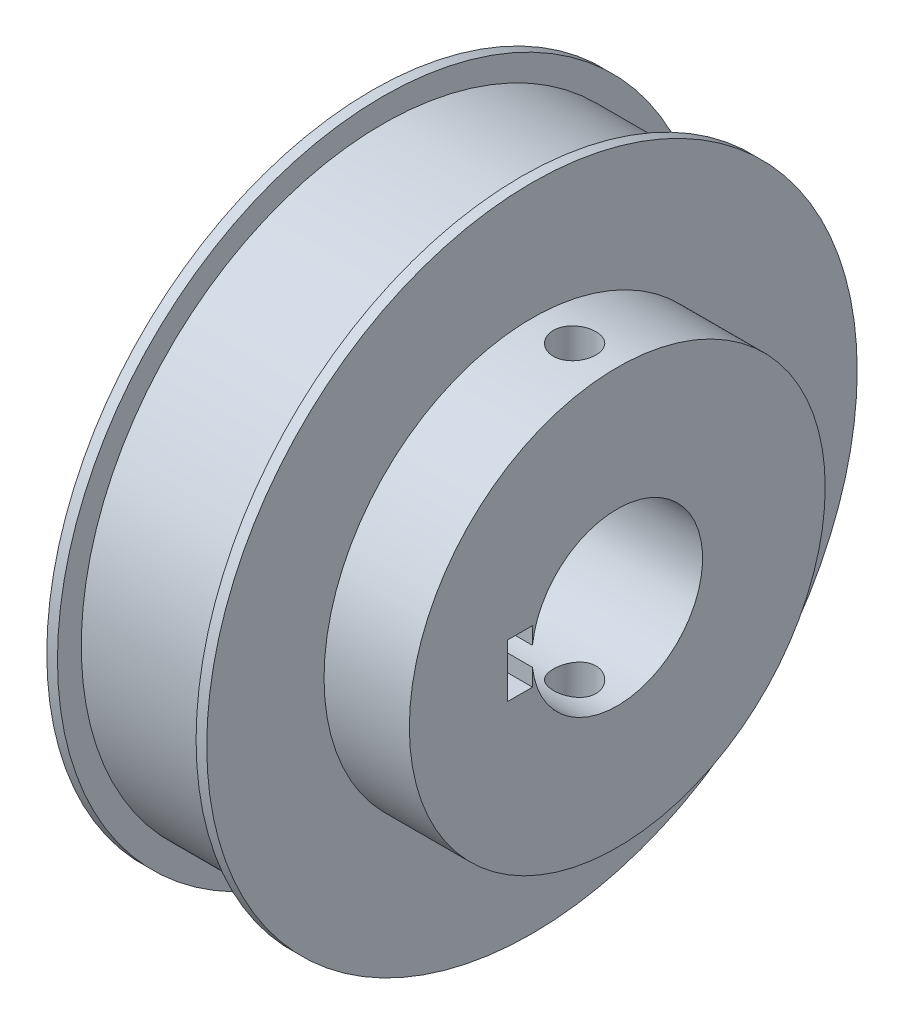
ISO-10303-21;
HEADER;
FILE_DESCRIPTION(('STEP AP214'),'2;1');
FILE_NAME('part.step','',(''),(''),'','','');
FILE_SCHEMA(('AUTOMOTIVE_DESIGN { 1 0 10303 214 1 1 1 1 }'));
ENDSEC;
DATA;
#1=APPLICATION_CONTEXT('core data for automotive mechanical design processes');
#2=APPLICATION_PROTOCOL_DEFINITION('international standard','automotive_design',2000,#1);
#3=PRODUCT_CONTEXT('',#1,'mechanical');
#4=PRODUCT('Part','Part','',(#3));
#5=PRODUCT_RELATED_PRODUCT_CATEGORY('part','',(#4));
#6=PRODUCT_DEFINITION_FORMATION('','',#4);
#7=PRODUCT_DEFINITION_CONTEXT('part definition',#1,'design');
#8=PRODUCT_DEFINITION('design','',#6,#7);
#9=PRODUCT_DEFINITION_SHAPE('','',#8);
#10=(LENGTH_UNIT() NAMED_UNIT(*) SI_UNIT(.MILLI.,.METRE.));
#11=(NAMED_UNIT(*) PLANE_ANGLE_UNIT() SI_UNIT($,.RADIAN.));
#12=(NAMED_UNIT(*) SI_UNIT($,.STERADIAN.) SOLID_ANGLE_UNIT());
#13=UNCERTAINTY_MEASURE_WITH_UNIT(LENGTH_MEASURE(1.E-05),#10,'distance_accuracy_value','');
#14=(GEOMETRIC_REPRESENTATION_CONTEXT(3) GLOBAL_UNCERTAINTY_ASSIGNED_CONTEXT((#13)) GLOBAL_UNIT_ASSIGNED_CONTEXT((#10,
#11,#12)) REPRESENTATION_CONTEXT('',''));
#15=CARTESIAN_POINT('',(0.,0.,0.));
#16=DIRECTION('',(0.,0.,1.));
#17=DIRECTION('',(1.,0.,0.));
#18=AXIS2_PLACEMENT_3D('',#15,#16,#17);
#19=CARTESIAN_POINT('',(0.0213,28.0213,38.4713));
#20=DIRECTION('',(0.,0.,1.));
#21=DIRECTION('',(1.,0.,0.));
#22=AXIS2_PLACEMENT_3D('',#19,#20,#21);
#23=PLANE('',#22);
#24=DIRECTION('',(0.,1.,0.));
#25=VECTOR('',#24,1.);
#26=CARTESIAN_POINT('',(23.0213,30.5213,38.4713));
#27=LINE('',#26,#25);
#28=CARTESIAN_POINT('',(23.0213,29.6282714450257,38.4713));
#29=VERTEX_POINT('',#28);
#30=CARTESIAN_POINT('',(23.0213,28.0213,38.4713));
#31=VERTEX_POINT('',#30);
#32=EDGE_CURVE('E79',#29,#31,#27,.F.);
#33=ORIENTED_EDGE('',*,*,#32,.F.);
#34=DIRECTION('',(1.,0.,0.));
#35=VECTOR('',#34,1.);
#36=CARTESIAN_POINT('',(0.0213,29.628271445025,38.4713));
#37=LINE('',#36,#35);
#38=CARTESIAN_POINT('',(0.0213,29.6282714450252,38.4713));
#39=VERTEX_POINT('',#38);
#40=EDGE_CURVE('E58',#29,#39,#37,.F.);
#41=ORIENTED_EDGE('',*,*,#40,.T.);
#42=DIRECTION('',(0.,1.,0.));
#43=VECTOR('',#42,1.);
#44=CARTESIAN_POINT('',(0.0213,28.0213,38.4713));
#45=LINE('',#44,#43);
#46=CARTESIAN_POINT('',(0.0213,28.0213,38.4713));
#47=VERTEX_POINT('',#46);
#48=EDGE_CURVE('E97',#39,#47,#45,.F.);
#49=ORIENTED_EDGE('',*,*,#48,.T.);
#50=DIRECTION('',(1.,0.,0.));
#51=VECTOR('',#50,1.);
#52=CARTESIAN_POINT('',(0.0213,28.0213,38.4713));
#53=LINE('',#52,#51);
#54=EDGE_CURVE('E114',#31,#47,#53,.F.);
#55=ORIENTED_EDGE('',*,*,#54,.F.);
#56=EDGE_LOOP('',(#33,#41,#49,#55));
#57=FACE_BOUND('',#56,.T.);
#58=ADVANCED_FACE('F16',(#57),#23,.T.);
#59=CARTESIAN_POINT('',(0.0213,28.0213,38.4713));
#60=DIRECTION('',(0.,0.,1.));
#61=DIRECTION('',(1.,0.,0.));
#62=AXIS2_PLACEMENT_3D('',#59,#60,#61);
#63=PLANE('',#62);
#64=DIRECTION('',(0.,1.,0.));
#65=VECTOR('',#64,1.);
#66=CARTESIAN_POINT('',(23.0213,30.5213,38.4713));
#67=LINE('',#66,#65);
#68=CARTESIAN_POINT('',(23.0213,33.0213,38.4713));
#69=VERTEX_POINT('',#68);
#70=CARTESIAN_POINT('',(23.0213,31.4143285549748,38.4713));
#71=VERTEX_POINT('',#70);
#72=EDGE_CURVE('E70',#69,#71,#67,.F.);
#73=ORIENTED_EDGE('',*,*,#72,.F.);
#74=DIRECTION('',(1.,0.,0.));
#75=VECTOR('',#74,1.);
#76=CARTESIAN_POINT('',(0.0213,33.0213,38.4713));
#77=LINE('',#76,#75);
#78=CARTESIAN_POINT('',(0.0213,33.0213,38.4713));
#79=VERTEX_POINT('',#78);
#80=EDGE_CURVE('E109',#69,#79,#77,.F.);
#81=ORIENTED_EDGE('',*,*,#80,.T.);
#82=DIRECTION('',(0.,1.,0.));
#83=VECTOR('',#82,1.);
#84=CARTESIAN_POINT('',(0.0213,28.0213,38.4713));
#85=LINE('',#84,#83);
#86=CARTESIAN_POINT('',(0.0213,31.4143285549738,38.4713000000001));
#87=VERTEX_POINT('',#86);
#88=EDGE_CURVE('E35',#79,#87,#85,.F.);
#89=ORIENTED_EDGE('',*,*,#88,.T.);
#90=DIRECTION('',(1.,0.,0.));
#91=VECTOR('',#90,1.);
#92=CARTESIAN_POINT('',(0.0213,31.414328554973,38.4713000000002));
#93=LINE('',#92,#91);
#94=EDGE_CURVE('E66',#87,#71,#93,.T.);
#95=ORIENTED_EDGE('',*,*,#94,.T.);
#96=EDGE_LOOP('',(#73,#81,#89,#95));
#97=FACE_BOUND('',#96,.T.);
#98=ADVANCED_FACE('F67',(#97),#63,.T.);
#99=CARTESIAN_POINT('',(23.0213,30.5213,30.5213));
#100=DIRECTION('',(1.,0.,0.));
#101=DIRECTION('',(0.,0.,-1.));
#102=AXIS2_PLACEMENT_3D('',#99,#100,#101);
#103=PLANE('',#102);
#104=DIRECTION('',(0.,0.,1.));
#105=VECTOR('',#104,1.);
#106=CARTESIAN_POINT('',(23.0213,33.0213,38.4713));
#107=LINE('',#106,#105);
#108=CARTESIAN_POINT('',(23.0213,33.0213,40.8213));
#109=VERTEX_POINT('',#108);
#110=EDGE_CURVE('E84',#109,#69,#107,.F.);
#111=ORIENTED_EDGE('',*,*,#110,.T.);
#112=ORIENTED_EDGE('',*,*,#72,.T.);
#113=CARTESIAN_POINT('',(23.0213,30.5213,30.5213));
#114=DIRECTION('',(1.,0.,0.));
#115=DIRECTION('',(0.,0.,-1.));
#116=AXIS2_PLACEMENT_3D('',#113,#114,#115);
#117=CIRCLE('',#116,8.);
#118=EDGE_CURVE('E20',#71,#29,#117,.F.);
#119=ORIENTED_EDGE('',*,*,#118,.T.);
#120=ORIENTED_EDGE('',*,*,#32,.T.);
#121=DIRECTION('',(0.,0.,1.));
#122=VECTOR('',#121,1.);
#123=CARTESIAN_POINT('',(23.0213,28.0213,38.4713));
#124=LINE('',#123,#122);
#125=CARTESIAN_POINT('',(23.0213,28.0213,40.8213));
#126=VERTEX_POINT('',#125);
#127=EDGE_CURVE('E117',#126,#31,#124,.F.);
#128=ORIENTED_EDGE('',*,*,#127,.F.);
#129=DIRECTION('',(0.,1.,0.));
#130=VECTOR('',#129,1.);
#131=CARTESIAN_POINT('',(23.0213,28.0213,40.8213));
#132=LINE('',#131,#130);
#133=EDGE_CURVE('E111',#126,#109,#132,.T.);
#134=ORIENTED_EDGE('',*,*,#133,.T.);
#135=EDGE_LOOP('',(#111,#112,#119,#120,#128,#134));
#136=FACE_BOUND('',#135,.T.);
#137=CARTESIAN_POINT('',(23.0213,30.5213,30.5213));
#138=DIRECTION('',(1.,0.,0.));
#139=DIRECTION('',(0.,0.,-1.));
#140=AXIS2_PLACEMENT_3D('',#137,#138,#139);
#141=CIRCLE('',#140,19.5);
#142=CARTESIAN_POINT('',(23.0213,30.5213,11.0213));
#143=VERTEX_POINT('',#142);
#144=EDGE_CURVE('E105',#143,#143,#141,.F.);
#145=ORIENTED_EDGE('',*,*,#144,.F.);
#146=EDGE_LOOP('',(#145));
#147=FACE_BOUND('',#146,.T.);
#148=ADVANCED_FACE('F80',(#136,#147),#103,.T.);
#149=CARTESIAN_POINT('',(19.0213,50.0213,30.5213));
#150=DIRECTION('',(0.,-1.,0.));
#151=DIRECTION('',(0.,0.,-1.));
#152=AXIS2_PLACEMENT_3D('',#149,#150,#151);
#153=CYLINDRICAL_SURFACE('',#152,2.);
#154=CARTESIAN_POINT('',(21.0213000416667,50.0213000416667,30.5213));
#155=CARTESIAN_POINT('',(21.0212952449661,50.0212988039961,30.6332257199853));
#156=CARTESIAN_POINT('',(21.0118656679429,50.0203254222127,30.745299632185));
#157=CARTESIAN_POINT('',(20.9743730017809,50.016534232403,30.966414845535));
#158=CARTESIAN_POINT('',(20.9462707943776,50.0137125524571,31.0754492784028));
#159=CARTESIAN_POINT('',(20.8722568807324,50.0065429669759,31.2871394420739));
#160=CARTESIAN_POINT('',(20.826362863846,50.0021965777769,31.3898013914173));
#161=CARTESIAN_POINT('',(20.7181022188427,49.9924644594225,31.5859155066101));
#162=CARTESIAN_POINT('',(20.6557427472886,49.9870791820839,31.6793716495086));
#163=CARTESIAN_POINT('',(20.5160566395998,49.9758482682691,31.8548365334591));
#164=CARTESIAN_POINT('',(20.4386790643447,49.9700011063528,31.936804631482));
#165=CARTESIAN_POINT('',(20.2712586054062,49.9585178137885,32.0866190392071));
#166=CARTESIAN_POINT('',(20.1812145125114,49.9528817033536,32.1544639991062));
#167=CARTESIAN_POINT('',(19.9907735152286,49.9424439847177,32.2742409440422));
#168=CARTESIAN_POINT('',(19.8903541188884,49.9376442527855,32.32613734531));
#169=CARTESIAN_POINT('',(19.6821697225814,49.9294411523572,32.4123161473707));
#170=CARTESIAN_POINT('',(19.5744049772475,49.9260377354853,32.4465991583957));
#171=CARTESIAN_POINT('',(19.354991723457,49.9210260308223,32.496461297801));
#172=CARTESIAN_POINT('',(19.2433582771978,49.9194114449488,32.5121060621168));
#173=CARTESIAN_POINT('',(19.0190391362712,49.9181406871204,32.5244505096382));
#174=CARTESIAN_POINT('',(18.9063534688261,49.9184844646399,32.521150681613));
#175=CARTESIAN_POINT('',(18.6835827805728,49.9210858336635,32.4957537491147));
#176=CARTESIAN_POINT('',(18.5734894657198,49.923336105053,32.4737285409038));
#177=CARTESIAN_POINT('',(18.3585692264664,49.9294855125986,32.4116176130418));
#178=CARTESIAN_POINT('',(18.2537424243687,49.933384687027,32.371531474182));
#179=CARTESIAN_POINT('',(18.0521017984836,49.9424011280114,32.274355832986));
#180=CARTESIAN_POINT('',(17.9553037043851,49.9475207129737,32.217233915389));
#181=CARTESIAN_POINT('',(17.7726491390129,49.9583986445013,32.0876365425042));
#182=CARTESIAN_POINT('',(17.6867921027281,49.964156958053,32.0151618805681));
#183=CARTESIAN_POINT('',(17.52804533039,49.9756953984157,31.8565296908881));
#184=CARTESIAN_POINT('',(17.4552149814833,49.9814755083042,31.7703127262092));
#185=CARTESIAN_POINT('',(17.3250175786765,49.9923849554681,31.5867977375404));
#186=CARTESIAN_POINT('',(17.2676576817804,49.997513990962,31.4894946143335));
#187=CARTESIAN_POINT('',(17.1700382015131,50.0065456027029,31.2865027261696));
#188=CARTESIAN_POINT('',(17.1297959076608,50.0104469378898,31.1808056101484));
#189=CARTESIAN_POINT('',(17.0677304060595,50.016567790704,30.9642500556859));
#190=CARTESIAN_POINT('',(17.0458681377659,50.0187908738579,30.8534030936173));
#191=CARTESIAN_POINT('',(17.0294183389221,50.0204688451888,30.7050626356356));
#192=CARTESIAN_POINT('',(17.0263762041943,50.0207799090044,30.6683811550961));
#193=CARTESIAN_POINT('',(17.0223162398791,50.0211956958089,30.5949051261092));
#194=CARTESIAN_POINT('',(17.0212984107397,50.0213004187521,30.5581105776369));
#195=CARTESIAN_POINT('',(17.0213048322826,50.0212987267483,30.409374276951));
#196=CARTESIAN_POINT('',(17.0307343533963,50.0203254014306,30.2973003616699));
#197=CARTESIAN_POINT('',(17.068226978917,50.0165342530182,30.0761851483488));
#198=CARTESIAN_POINT('',(17.0963292010763,50.0137125579189,29.9671507184797));
#199=CARTESIAN_POINT('',(17.1703431245879,50.0065429614441,29.7554605588135));
#200=CARTESIAN_POINT('',(17.2162371367967,50.0021965763692,29.6527986105448));
#201=CARTESIAN_POINT('',(17.3244977785924,49.9924644610024,29.4566844949112));
#202=CARTESIAN_POINT('',(17.3868572520325,49.987079182503,29.3632283507295));
#203=CARTESIAN_POINT('',(17.5265433619495,49.9758482677788,29.1877634652116));
#204=CARTESIAN_POINT('',(17.6039209374232,49.970001106122,29.1057953668097));
#205=CARTESIAN_POINT('',(17.7713413963718,49.958517813776,28.9559809593282));
#206=CARTESIAN_POINT('',(17.8613854889202,49.9528817032976,28.8881359998978));
#207=CARTESIAN_POINT('',(18.0518264856428,49.9424439846474,28.7683590555056));
#208=CARTESIAN_POINT('',(18.1522458818063,49.9376442527479,28.7164626543717));
#209=CARTESIAN_POINT('',(18.3604302781222,49.9294411523397,28.6302838523687));
#210=CARTESIAN_POINT('',(18.4681950236676,49.9260377354601,28.5960008413292));
#211=CARTESIAN_POINT('',(18.6876082777112,49.9210260307999,28.5461387020004));
#212=CARTESIAN_POINT('',(18.7992417240057,49.9194114449342,28.5304939377475));
#213=CARTESIAN_POINT('',(19.0235608649367,49.9181406871214,28.5181494903649));
#214=CARTESIAN_POINT('',(19.1362465323506,49.9184844646475,28.5214493184563));
#215=CARTESIAN_POINT('',(19.3590172206539,49.921085833684,28.5468462510899));
#216=CARTESIAN_POINT('',(19.4691105355856,49.9233361050818,28.5688714593904));
#217=CARTESIAN_POINT('',(19.6840307747959,49.9294855126433,28.6309823874059));
#218=CARTESIAN_POINT('',(19.7888575767806,49.9333846870765,28.671068526299));
#219=CARTESIAN_POINT('',(19.9904982022038,49.9424011280441,28.7682441674182));
#220=CARTESIAN_POINT('',(20.087296295972,49.9475207129818,28.8253660848671));
#221=CARTESIAN_POINT('',(20.2699508613653,49.958398644537,28.9549634577613));
#222=CARTESIAN_POINT('',(20.3558078979338,49.9641569581448,29.0274381199503));
#223=CARTESIAN_POINT('',(20.5145546709821,49.9756953984716,29.1860703106267));
#224=CARTESIAN_POINT('',(20.5873850202454,49.9814755082673,29.2722872761183));
#225=CARTESIAN_POINT('',(20.7175824230739,49.9923849557966,29.455802265036));
#226=CARTESIAN_POINT('',(20.77494231989,49.9975139917598,29.5531053874976));
#227=CARTESIAN_POINT('',(20.8725617975646,50.0065456019737,29.7560972735566));
#228=CARTESIAN_POINT('',(20.9128040889906,50.0104469351682,29.8617943881755));
#229=CARTESIAN_POINT('',(20.9748695962545,50.0165677933185,30.0783499424026));
#230=CARTESIAN_POINT('',(20.9967318721283,50.0187908837364,30.1891969057823));
#231=CARTESIAN_POINT('',(21.0131816579855,50.02046884197,30.3375373658827));
#232=CARTESIAN_POINT('',(21.0162237876461,50.0207799007193,30.3742188468414));
#233=CARTESIAN_POINT('',(21.0202837684745,50.0211957041139,30.4476948754636));
#234=CARTESIAN_POINT('',(21.0213016192247,50.0213004487167,30.4844894231504));
#235=CARTESIAN_POINT('',(21.0213000416667,50.0213000416667,30.5213));
#236=B_SPLINE_CURVE_WITH_KNOTS('',3,(#154,#155,#156,#157,#158,#159,#160,#161,#162,#163,#164,
#165,#166,#167,#168,#169,#170,#171,#172,#173,#174,#175,#176,#177,#178,#179,#180,#181,#182,#183,
#184,#185,#186,#187,#188,#189,#190,#191,#192,#193,#194,#195,#196,#197,#198,#199,#200,#201,#202,
#203,#204,#205,#206,#207,#208,#209,#210,#211,#212,#213,#214,#215,#216,#217,#218,#219,#220,#221,
#222,#223,#224,#225,#226,#227,#228,#229,#230,#231,#232,#233,#234,#235),.UNSPECIFIED.,.T.,.F.,(4,
2,2,2,2,2,2,2,2,2,2,2,2,2,2,2,2,2,2,2,2,2,2,2,2,2,2,2,2,2,2,2,2,2,2,2,2,2,2,2,4),(0.,
0.335636973965113,0.671979317597064,1.00798810981353,1.34385109852633,1.68087384584154,
2.01792878895439,2.3557303849996,2.69352027680916,3.03011706721512,3.36670517348347,
3.70200675294387,4.03731611542408,4.37326761174449,4.70920175203519,5.04663037054472,
5.38421482494498,5.72213944920167,6.05934410017865,6.16972970214156,6.28011532852622,
6.61575230682097,6.95209464284481,7.28810343108636,7.62396642434724,7.96098917350013,
8.29804411477922,8.63584571023136,8.97363560263294,9.31023239312093,9.64682049930136,
9.98212207904463,10.3174314412404,10.6533829365222,10.9893170778567,11.3267456991399,
11.6643301507704,12.0022547705161,12.3394594260006,12.4498450288431,12.5602306544646),.UNSPECIFIED.);
#237=CARTESIAN_POINT('',(21.0213000416667,50.0213000416667,30.5213));
#238=VERTEX_POINT('',#237);
#239=EDGE_CURVE('E163',#238,#238,#236,.T.);
#240=ORIENTED_EDGE('',*,*,#239,.F.);
#241=EDGE_LOOP('',(#240));
#242=FACE_BOUND('',#241,.T.);
#243=CARTESIAN_POINT('',(21.0213,38.5213,30.5213));
#244=CARTESIAN_POINT('',(21.0212943551092,38.5212967232233,30.4109265058065));
#245=CARTESIAN_POINT('',(21.0121228022313,38.5189904338893,30.3004232140391));
#246=CARTESIAN_POINT('',(20.975703069722,38.5100040073668,30.0824852357951));
#247=CARTESIAN_POINT('',(20.9484208560528,38.5033156355606,29.9750567247731));
#248=CARTESIAN_POINT('',(20.8767088873548,38.4863070093234,29.7665940848464));
#249=CARTESIAN_POINT('',(20.8323085240754,38.475992982781,29.6655493392886));
#250=CARTESIAN_POINT('',(20.7277072322132,38.4528341840969,29.472375781654));
#251=CARTESIAN_POINT('',(20.6675103883455,38.4399900664097,29.3802446730716));
#252=CARTESIAN_POINT('',(20.5317008259397,38.412865884715,29.2055668233512));
#253=CARTESIAN_POINT('',(20.4558220705619,38.3985635464031,29.1232303508182));
#254=CARTESIAN_POINT('',(20.2913685910166,38.370282371055,28.9723051174588));
#255=CARTESIAN_POINT('',(20.2027917412094,38.3563035886375,28.903718662982));
#256=CARTESIAN_POINT('',(20.0138393237289,38.3300302901337,28.7812643886937));
#257=CARTESIAN_POINT('',(19.9133082417737,38.3177638306106,28.7276299667376));
#258=CARTESIAN_POINT('',(19.7043012748183,38.2966265285306,28.6381038371054));
#259=CARTESIAN_POINT('',(19.595826725028,38.2877551168569,28.6022091553972));
#260=CARTESIAN_POINT('',(19.3763087356128,38.2746396932728,28.5498935681706));
#261=CARTESIAN_POINT('',(19.2653602740414,38.2703065518464,28.5330969957999));
#262=CARTESIAN_POINT('',(19.0421420445204,38.2664914988918,28.5182842977197));
#263=CARTESIAN_POINT('',(18.9298724928555,38.267008804003,28.5202651394058));
#264=CARTESIAN_POINT('',(18.7100792808956,38.2727560641484,28.5426512620788));
#265=CARTESIAN_POINT('',(18.6025065484016,38.2778714728833,28.5626087406262));
#266=CARTESIAN_POINT('',(18.3922859446402,38.2920560689353,28.6196675127474));
#267=CARTESIAN_POINT('',(18.2896384573448,38.3011255639587,28.6567701405674));
#268=CARTESIAN_POINT('',(18.090979299873,38.3223018759886,28.7474488629789));
#269=CARTESIAN_POINT('',(17.9950453394808,38.3344385158416,28.801187946315));
#270=CARTESIAN_POINT('',(17.8134026143021,38.3603637372651,28.9234963472254));
#271=CARTESIAN_POINT('',(17.7276949562499,38.374152497312,28.99206726771));
#272=CARTESIAN_POINT('',(17.5663782019942,38.4023088932488,29.1443996069856));
#273=CARTESIAN_POINT('',(17.491124192049,38.4166818591952,29.228536494027));
#274=CARTESIAN_POINT('',(17.355695671491,38.444040996237,29.4084473024731));
#275=CARTESIAN_POINT('',(17.2955276476748,38.4570265693972,29.5042262036146));
#276=CARTESIAN_POINT('',(17.1918501103733,38.4802141964943,29.7052357541348));
#277=CARTESIAN_POINT('',(17.1484114496638,38.4904043599643,29.810504323475));
#278=CARTESIAN_POINT('',(17.0800276118664,38.5067505931434,30.0270328167494));
#279=CARTESIAN_POINT('',(17.0550439144675,38.5129150623863,30.1382797383203));
#280=CARTESIAN_POINT('',(17.0335606388046,38.5182422052241,30.2955853685857));
#281=CARTESIAN_POINT('',(17.0289673432076,38.5193860551192,30.3405913577974));
#282=CARTESIAN_POINT('',(17.0228358630925,38.5209156250803,30.430824292738));
#283=CARTESIAN_POINT('',(17.0212976858183,38.5213013433487,30.4760512389906));
#284=CARTESIAN_POINT('',(17.0213056448908,38.5212967232233,30.6316734941935));
#285=CARTESIAN_POINT('',(17.0304771977687,38.5189904338893,30.7421767859609));
#286=CARTESIAN_POINT('',(17.066896930278,38.5100040073668,30.9601147642049));
#287=CARTESIAN_POINT('',(17.0941791439473,38.5033156355606,31.0675432752269));
#288=CARTESIAN_POINT('',(17.1658911126452,38.4863070093234,31.2760059151536));
#289=CARTESIAN_POINT('',(17.2102914759246,38.475992982781,31.3770506607114));
#290=CARTESIAN_POINT('',(17.3148927677868,38.4528341840969,31.570224218346));
#291=CARTESIAN_POINT('',(17.3750896116545,38.4399900664097,31.6623553269284));
#292=CARTESIAN_POINT('',(17.5108991740603,38.412865884715,31.8370331766488));
#293=CARTESIAN_POINT('',(17.5867779294381,38.3985635464031,31.9193696491818));
#294=CARTESIAN_POINT('',(17.7512314089834,38.370282371055,32.0702948825412));
#295=CARTESIAN_POINT('',(17.8398082587906,38.3563035886375,32.138881337018));
#296=CARTESIAN_POINT('',(18.0287606762711,38.3300302901337,32.2613356113063));
#297=CARTESIAN_POINT('',(18.1292917582263,38.3177638306106,32.3149700332624));
#298=CARTESIAN_POINT('',(18.3382987251817,38.2966265285306,32.4044961628946));
#299=CARTESIAN_POINT('',(18.446773274972,38.2877551168569,32.4403908446028));
#300=CARTESIAN_POINT('',(18.6662912643872,38.2746396932728,32.4927064318294));
#301=CARTESIAN_POINT('',(18.7772397259586,38.2703065518464,32.5095030042001));
#302=CARTESIAN_POINT('',(19.0004579554796,38.2664914988918,32.5243157022803));
#303=CARTESIAN_POINT('',(19.1127275071445,38.267008804003,32.5223348605942));
#304=CARTESIAN_POINT('',(19.3325207191044,38.2727560641484,32.4999487379212));
#305=CARTESIAN_POINT('',(19.4400934515984,38.2778714728833,32.4799912593738));
#306=CARTESIAN_POINT('',(19.6503140553598,38.2920560689353,32.4229324872526));
#307=CARTESIAN_POINT('',(19.7529615426552,38.3011255639587,32.3858298594326));
#308=CARTESIAN_POINT('',(19.951620700127,38.3223018759886,32.2951511370211));
#309=CARTESIAN_POINT('',(20.0475546605192,38.3344385158416,32.241412053685));
#310=CARTESIAN_POINT('',(20.2291973856979,38.3603637372651,32.1191036527746));
#311=CARTESIAN_POINT('',(20.31490504375,38.374152497312,32.05053273229));
#312=CARTESIAN_POINT('',(20.4762217980058,38.4023088932488,31.8982003930144));
#313=CARTESIAN_POINT('',(20.551475807951,38.4166818591952,31.814063505973));
#314=CARTESIAN_POINT('',(20.686904328509,38.444040996237,31.6341526975269));
#315=CARTESIAN_POINT('',(20.7470723523252,38.4570265693972,31.5383737963854));
#316=CARTESIAN_POINT('',(20.8507498896267,38.4802141964943,31.3373642458652));
#317=CARTESIAN_POINT('',(20.8941885503362,38.4904043599643,31.232095676525));
#318=CARTESIAN_POINT('',(20.9625723881336,38.5067505931434,31.0155671832507));
#319=CARTESIAN_POINT('',(20.9875560855325,38.5129150623863,30.9043202616798));
#320=CARTESIAN_POINT('',(21.0090393611955,38.5182422052241,30.7470146314143));
#321=CARTESIAN_POINT('',(21.0136326567925,38.5193860551192,30.7020086422026));
#322=CARTESIAN_POINT('',(21.0197641369075,38.5209156250803,30.611775707262));
#323=CARTESIAN_POINT('',(21.0213023141816,38.5213013433487,30.5665487610094));
#324=CARTESIAN_POINT('',(21.0213,38.5213,30.5213));
#325=B_SPLINE_CURVE_WITH_KNOTS('',3,(#243,#244,#245,#246,#247,#248,#249,#250,#251,#252,#253,
#254,#255,#256,#257,#258,#259,#260,#261,#262,#263,#264,#265,#266,#267,#268,#269,#270,#271,#272,
#273,#274,#275,#276,#277,#278,#279,#280,#281,#282,#283,#284,#285,#286,#287,#288,#289,#290,#291,
#292,#293,#294,#295,#296,#297,#298,#299,#300,#301,#302,#303,#304,#305,#306,#307,#308,#309,#310,
#311,#312,#313,#314,#315,#316,#317,#318,#319,#320,#321,#322,#323,#324),.UNSPECIFIED.,.T.,.F.,(4,
2,2,2,2,2,2,2,2,2,2,2,2,2,2,2,2,2,2,2,2,2,2,2,2,2,2,2,2,2,2,2,2,2,2,2,2,2,2,2,4),(0.,
0.330946983045446,0.662517657801357,0.993521545220031,1.32443992457114,1.66151658222464,
1.99864973197669,2.34078329803452,2.68285948660786,3.01808373561039,3.35325384589237,
3.68029888738367,4.00736938400806,4.33775143805342,4.66816921509436,5.00795227856435,
5.34788119516374,5.68923436048328,6.02987300392473,6.16554783732439,6.30122299241518,
6.63216997546062,6.96374065021654,7.29474453763522,7.62566291698632,7.96273957463982,
8.29987272439186,8.6420062904497,8.98408247902304,9.31930672802556,9.65447683830756,
9.98152187979886,10.3085923764233,10.6389744304686,10.9693922075095,11.3091752709795,
11.6491041875789,11.9904573528985,12.3310959963399,12.4667708297396,12.6024459848304),.UNSPECIFIED.);
#326=CARTESIAN_POINT('',(21.0213,38.5213,30.5213));
#327=VERTEX_POINT('',#326);
#328=EDGE_CURVE('E86',#327,#327,#325,.T.);
#329=ORIENTED_EDGE('',*,*,#328,.F.);
#330=EDGE_LOOP('',(#329));
#331=FACE_BOUND('',#330,.T.);
#332=ADVANCED_FACE('F197',(#242,#331),#153,.F.);
#333=CARTESIAN_POINT('',(19.0213,11.0213,30.5213));
#334=DIRECTION('',(0.,1.,0.));
#335=DIRECTION('',(0.,0.,1.));
#336=AXIS2_PLACEMENT_3D('',#333,#334,#335);
#337=CYLINDRICAL_SURFACE('',#336,2.);
#338=CARTESIAN_POINT('',(21.0213,11.0213,30.5213));
#339=CARTESIAN_POINT('',(21.0212951677174,11.0213012732517,30.4093742769514));
#340=CARTESIAN_POINT('',(21.0118656466037,11.0222745985694,30.2973003616704));
#341=CARTESIAN_POINT('',(20.9743730210831,11.0260657469818,30.0761851483492));
#342=CARTESIAN_POINT('',(20.9462707989238,11.0288874420811,29.9671507184799));
#343=CARTESIAN_POINT('',(20.8722568754122,11.0360570385559,29.7554605588137));
#344=CARTESIAN_POINT('',(20.8263628632035,11.0404034236308,29.6527986105452));
#345=CARTESIAN_POINT('',(20.7181022214078,11.0501355389976,29.4566844949115));
#346=CARTESIAN_POINT('',(20.6557427479676,11.055520817497,29.3632283507297));
#347=CARTESIAN_POINT('',(20.5160566380495,11.0667517322213,29.1877634652104));
#348=CARTESIAN_POINT('',(20.4386790625747,11.0725988938781,29.1057953668074));
#349=CARTESIAN_POINT('',(20.2712586036257,11.0840821862241,28.9559809593263));
#350=CARTESIAN_POINT('',(20.1812145110785,11.0897182967025,28.888135999897));
#351=CARTESIAN_POINT('',(19.9907735143635,11.1001560153522,28.7683590555095));
#352=CARTESIAN_POINT('',(19.8903541182069,11.1049557472514,28.7164626543785));
#353=CARTESIAN_POINT('',(19.682169721892,11.1131588476599,28.6302838523732));
#354=CARTESIAN_POINT('',(19.5744049763397,11.1165622645398,28.5960008413309));
#355=CARTESIAN_POINT('',(19.3549917222594,11.1215739692007,28.5461387019937));
#356=CARTESIAN_POINT('',(19.2433582759342,11.1231885550666,28.5304939377391));
#357=CARTESIAN_POINT('',(19.0190391350026,11.1244593128785,28.5181494903666));
#358=CARTESIAN_POINT('',(18.9063534676195,11.1241155353524,28.5214493184597));
#359=CARTESIAN_POINT('',(18.6835827794549,11.1215141663171,28.5468462510774));
#360=CARTESIAN_POINT('',(18.5734894646295,11.1192638949217,28.5688714593471));
#361=CARTESIAN_POINT('',(18.3585692254111,11.1131144873653,28.6309823873273));
#362=CARTESIAN_POINT('',(18.2537424233222,11.1092153129315,28.6710685262512));
#363=CARTESIAN_POINT('',(18.0521017974761,11.1001988719382,28.7682441675707));
#364=CARTESIAN_POINT('',(17.9553037034069,11.0950792869725,28.8253660852256));
#365=CARTESIAN_POINT('',(17.7726491381085,11.0842013554405,28.9549634582169));
#366=CARTESIAN_POINT('',(17.6867921018675,11.0784430418877,29.0274381202009));
#367=CARTESIAN_POINT('',(17.5280453296224,11.0669046015252,29.1860703099704));
#368=CARTESIAN_POINT('',(17.4552149807653,11.0611244916379,29.272287274691));
#369=CARTESIAN_POINT('',(17.3250175780631,11.0502150444783,29.455802263436));
#370=CARTESIAN_POINT('',(17.2676576812222,11.0450860089876,29.5531053866772));
#371=CARTESIAN_POINT('',(17.1700382010715,11.036054397255,29.7560972748987));
#372=CARTESIAN_POINT('',(17.1297959072802,11.0321530620732,29.8617943909431));
#373=CARTESIAN_POINT('',(17.0677304058041,11.0260322092703,30.0783499454407));
#374=CARTESIAN_POINT('',(17.0458681375745,11.0238091261227,30.1891969075212));
#375=CARTESIAN_POINT('',(17.0294183388375,11.0221311548025,30.3375373653205));
#376=CARTESIAN_POINT('',(17.0263762041413,11.0218200909902,30.3742188456699));
#377=CARTESIAN_POINT('',(17.0223162398685,11.02140430419,30.4476948742747));
#378=CARTESIAN_POINT('',(17.0212984107397,11.0212995812479,30.4844894225551));
#379=CARTESIAN_POINT('',(17.0213048322826,11.0213012732517,30.6332257230486));
#380=CARTESIAN_POINT('',(17.0307343533963,11.0222745985694,30.7452996383296));
#381=CARTESIAN_POINT('',(17.0682269789169,11.0260657469818,30.9664148516508));
#382=CARTESIAN_POINT('',(17.0963292010762,11.0288874420811,31.0754492815201));
#383=CARTESIAN_POINT('',(17.1703431245878,11.0360570385559,31.2871394411863));
#384=CARTESIAN_POINT('',(17.2162371367965,11.0404034236308,31.3898013894548));
#385=CARTESIAN_POINT('',(17.3244977785922,11.0501355389976,31.5859155050885));
#386=CARTESIAN_POINT('',(17.3868572520324,11.055520817497,31.6793716492703));
#387=CARTESIAN_POINT('',(17.5265433619505,11.0667517322213,31.8548365347897));
#388=CARTESIAN_POINT('',(17.6039209374253,11.0725988938781,31.9368046331926));
#389=CARTESIAN_POINT('',(17.7713413963743,11.0840821862241,32.0866190406737));
#390=CARTESIAN_POINT('',(17.8613854889215,11.0897182967025,32.154464000103));
#391=CARTESIAN_POINT('',(18.0518264856365,11.1001560153522,32.2742409444905));
#392=CARTESIAN_POINT('',(18.1522458817931,11.1049557472514,32.3261373456215));
#393=CARTESIAN_POINT('',(18.3604302781081,11.1131588476599,32.4123161476268));
#394=CARTESIAN_POINT('',(18.4681950236603,11.1165622645398,32.4465991586691));
#395=CARTESIAN_POINT('',(18.6876082777406,11.1215739692007,32.4964612980063));
#396=CARTESIAN_POINT('',(18.7992417240658,11.1231885550666,32.5121060622609));
#397=CARTESIAN_POINT('',(19.0235608649974,11.1244593128785,32.5244505096334));
#398=CARTESIAN_POINT('',(19.1362465323805,11.1241155353524,32.5211506815403));
#399=CARTESIAN_POINT('',(19.3590172205451,11.1215141663171,32.4957537489226));
#400=CARTESIAN_POINT('',(19.4691105353705,11.1192638949217,32.4737285406529));
#401=CARTESIAN_POINT('',(19.6840307745889,11.1131144873653,32.4116176126727));
#402=CARTESIAN_POINT('',(19.7888575766778,11.1092153129315,32.3715314737488));
#403=CARTESIAN_POINT('',(19.9904982025239,11.1001988719382,32.2743558324293));
#404=CARTESIAN_POINT('',(20.0872962965931,11.0950792869725,32.2172339147744));
#405=CARTESIAN_POINT('',(20.2699508618915,11.0842013554405,32.0876365417831));
#406=CARTESIAN_POINT('',(20.3558078981325,11.0784430418877,32.0151618797991));
#407=CARTESIAN_POINT('',(20.5145546703776,11.0669046015252,31.8565296900297));
#408=CARTESIAN_POINT('',(20.5873850192347,11.0611244916379,31.770312725309));
#409=CARTESIAN_POINT('',(20.7175824219369,11.0502150444783,31.586797736564));
#410=CARTESIAN_POINT('',(20.7749423187778,11.0450860089876,31.4894946133228));
#411=CARTESIAN_POINT('',(20.8725617989285,11.036054397255,31.2865027251013));
#412=CARTESIAN_POINT('',(20.9128040927198,11.0321530620732,31.1808056090569));
#413=CARTESIAN_POINT('',(20.9748695941959,11.0260322092703,30.9642500545593));
#414=CARTESIAN_POINT('',(20.9967318624255,11.0238091261227,30.8534030924788));
#415=CARTESIAN_POINT('',(21.0131816611625,11.0221311548025,30.7050626346795));
#416=CARTESIAN_POINT('',(21.0162237958587,11.0218200909902,30.6683811543301));
#417=CARTESIAN_POINT('',(21.0202837601315,11.02140430419,30.5949051257253));
#418=CARTESIAN_POINT('',(21.0213015892603,11.0212995812479,30.5581105774448));
#419=CARTESIAN_POINT('',(21.0213,11.0213,30.5213));
#420=B_SPLINE_CURVE_WITH_KNOTS('',3,(#338,#339,#340,#341,#342,#343,#344,#345,#346,#347,#348,
#349,#350,#351,#352,#353,#354,#355,#356,#357,#358,#359,#360,#361,#362,#363,#364,#365,#366,#367,
#368,#369,#370,#371,#372,#373,#374,#375,#376,#377,#378,#379,#380,#381,#382,#383,#384,#385,#386,
#387,#388,#389,#390,#391,#392,#393,#394,#395,#396,#397,#398,#399,#400,#401,#402,#403,#404,#405,
#406,#407,#408,#409,#410,#411,#412,#413,#414,#415,#416,#417,#418,#419),.UNSPECIFIED.,.T.,.F.,(4,
2,2,2,2,2,2,2,2,2,2,2,2,2,2,2,2,2,2,2,2,2,2,2,2,2,2,2,2,2,2,2,2,2,2,2,2,2,2,2,4),(0.,
0.33563697829401,0.671979314318592,1.00798810255952,1.34385109582102,1.68087384497858,
2.017928786253,2.35573038168302,2.69352027410672,3.03011706468505,3.36670517077514,
3.70200675019033,4.03731611271423,4.37326760904736,4.70920174933052,5.04663036783982,
5.38421482224415,5.72213944650014,6.05934409747432,6.16972969886161,6.28011532467066,
6.61575230296467,6.95209463898925,7.28810342723018,7.62396642049167,7.96098916964924,
8.29804411092365,8.63584570635368,8.97363559877738,9.31023238935571,9.6468204954458,
9.98212207486099,10.3174314373849,10.653382933718,10.9893170740012,11.3267456925105,
11.6643301469148,12.0022547711708,12.339459422145,12.4498450235323,12.5602306493413),.UNSPECIFIED.);
#421=CARTESIAN_POINT('',(21.0213,11.0213,30.5213));
#422=VERTEX_POINT('',#421);
#423=EDGE_CURVE('E155',#422,#422,#420,.T.);
#424=ORIENTED_EDGE('',*,*,#423,.F.);
#425=EDGE_LOOP('',(#424));
#426=FACE_BOUND('',#425,.T.);
#427=CARTESIAN_POINT('',(21.0213,22.5213,30.5213));
#428=CARTESIAN_POINT('',(21.0212968990158,22.5213018684265,30.6318014515596));
#429=CARTESIAN_POINT('',(21.0121112656349,22.5236122915757,30.7423375437744));
#430=CARTESIAN_POINT('',(20.975666464924,22.5326051489347,30.9602417650274));
#431=CARTESIAN_POINT('',(20.9483970539495,22.539290061067,31.0676080624943));
#432=CARTESIAN_POINT('',(20.8767143287172,22.5562916489062,31.2759944962434));
#433=CARTESIAN_POINT('',(20.832321601713,22.5666039621059,31.3770220845733));
#434=CARTESIAN_POINT('',(20.7277248132736,22.589762082565,31.5701961758726));
#435=CARTESIAN_POINT('',(20.667520218508,22.6026079752779,31.6623423791317));
#436=CARTESIAN_POINT('',(20.5316989471278,22.6297344854441,31.8370359030679));
#437=CARTESIAN_POINT('',(20.4558179000546,22.644037238025,31.9193742534147));
#438=CARTESIAN_POINT('',(20.291363726788,22.6723183984275,32.0702985696044));
#439=CARTESIAN_POINT('',(20.2027891694041,22.6862967694684,32.1388829825989));
#440=CARTESIAN_POINT('',(20.013839697684,22.7125696573578,32.2613353903986));
#441=CARTESIAN_POINT('',(19.9133090255884,22.7248360738025,32.3149696212335));
#442=CARTESIAN_POINT('',(19.7043021177866,22.7459734024265,32.4044958780677));
#443=CARTESIAN_POINT('',(19.5958271555573,22.7548448574078,32.4403907405869));
#444=CARTESIAN_POINT('',(19.3763086690645,22.7679603107157,32.492706449073));
#445=CARTESIAN_POINT('',(19.265360138616,22.7722934533732,32.5095030244427));
#446=CARTESIAN_POINT('',(19.0421419080009,22.7761085005388,32.5243157000885));
#447=CARTESIAN_POINT('',(18.9298724257438,22.7755911942943,32.5223348557575));
#448=CARTESIAN_POINT('',(18.7100789230062,22.7698439264424,32.4999486995196));
#449=CARTESIAN_POINT('',(18.6025058380462,22.7647284932361,32.4799911202542));
#450=CARTESIAN_POINT('',(18.3922852654519,22.7505438710524,32.422932249204));
#451=CARTESIAN_POINT('',(18.2896381292948,22.7414744004102,32.3858297360925));
#452=CARTESIAN_POINT('',(18.0909826449972,22.7202984812579,32.2951526372496));
#453=CARTESIAN_POINT('',(17.9950517709472,22.7081623004025,32.2414155563106));
#454=CARTESIAN_POINT('',(17.8134083869909,22.6822371887201,32.1191083680199));
#455=CARTESIAN_POINT('',(17.7276976692437,22.6684479688716,32.0505356650785));
#456=CARTESIAN_POINT('',(17.5663618457408,22.6402882594681,31.8981845662416));
#457=CARTESIAN_POINT('',(17.4910940132515,22.62591240696,31.8140283442212));
#458=CARTESIAN_POINT('',(17.3556716767148,22.5985537922833,31.6341158900049));
#459=CARTESIAN_POINT('',(17.2955176343152,22.5855710726746,31.5383593036106));
#460=CARTESIAN_POINT('',(17.1918992183675,22.5623969054108,31.3374545182419));
#461=CARTESIAN_POINT('',(17.1484928796608,22.552215198297,31.2322751909448));
#462=CARTESIAN_POINT('',(17.0800769257206,22.5358611067811,31.0158013441905));
#463=CARTESIAN_POINT('',(17.0550637914425,22.5296879554763,30.9045079988673));
#464=CARTESIAN_POINT('',(17.0246899125882,22.522160009715,30.68201996052));
#465=CARTESIAN_POINT('',(17.0188426318996,22.520685953223,30.570895626651));
#466=CARTESIAN_POINT('',(17.0256320027407,22.522382602474,30.3492561669313));
#467=CARTESIAN_POINT('',(17.0382669903988,22.5255528901087,30.2387409871405));
#468=CARTESIAN_POINT('',(17.0812612111885,22.5361055849686,30.0231476416314));
#469=CARTESIAN_POINT('',(17.1113550179693,22.5434248775225,29.9180131747083));
#470=CARTESIAN_POINT('',(17.1881094453713,22.5614505782115,29.71429027673));
#471=CARTESIAN_POINT('',(17.2347717390842,22.5721573284014,29.6157025079565));
#472=CARTESIAN_POINT('',(17.3442815051663,22.5960558943159,29.4259358207602));
#473=CARTESIAN_POINT('',(17.4074014831957,22.6092884351076,29.3349194108856));
#474=CARTESIAN_POINT('',(17.5476865450626,22.6367065441677,29.1645978484757));
#475=CARTESIAN_POINT('',(17.6248540528225,22.6508922766439,29.0852947213693));
#476=CARTESIAN_POINT('',(17.7933026144593,22.6790472405231,28.9386459092364));
#477=CARTESIAN_POINT('',(17.8848836040032,22.6930026108363,28.8716415098373));
#478=CARTESIAN_POINT('',(18.0782768459543,22.7187282883035,28.7539523213164));
#479=CARTESIAN_POINT('',(18.1800886439463,22.7304986924397,28.7032668077894));
#480=CARTESIAN_POINT('',(18.3905076298841,22.7503920702045,28.6200314391876));
#481=CARTESIAN_POINT('',(18.4990701711253,22.7585365961079,28.5873741377946));
#482=CARTESIAN_POINT('',(18.7203795171855,22.7702767454642,28.5408391200616));
#483=CARTESIAN_POINT('',(18.8331254013767,22.7738733637342,28.5269572966951));
#484=CARTESIAN_POINT('',(19.0561280318069,22.7760346506139,28.5185818795547));
#485=CARTESIAN_POINT('',(19.166363246833,22.7747408969565,28.5235428029598));
#486=CARTESIAN_POINT('',(19.3843718515573,22.7675945465621,28.5514636289162));
#487=CARTESIAN_POINT('',(19.4921452906849,22.7617420414419,28.574423169751));
#488=CARTESIAN_POINT('',(19.7015779454205,22.7462165242304,28.6373915740763));
#489=CARTESIAN_POINT('',(19.8032697403203,22.7365664635159,28.6772981270928));
#490=CARTESIAN_POINT('',(19.9985871769516,22.714529923669,28.7729467818599));
#491=CARTESIAN_POINT('',(20.0922116975826,22.7021430650564,28.8286910799544));
#492=CARTESIAN_POINT('',(20.2713728386694,22.6756248764865,28.9561430018171));
#493=CARTESIAN_POINT('',(20.3566347645653,22.6614564689099,29.028229116117));
#494=CARTESIAN_POINT('',(20.5140293930605,22.6331929700495,29.1855808384137));
#495=CARTESIAN_POINT('',(20.586158973484,22.6190978969725,29.2708495716518));
#496=CARTESIAN_POINT('',(20.7165150780861,22.5922645913645,29.4540098843965));
#497=CARTESIAN_POINT('',(20.7744661515621,22.5795555551218,29.5521021035782));
#498=CARTESIAN_POINT('',(20.8729632839207,22.5572343336651,29.756945253986));
#499=CARTESIAN_POINT('',(20.913521814198,22.5476199306696,29.8636899154177));
#500=CARTESIAN_POINT('',(20.9700624404395,22.5339925391261,30.0620863290087));
#501=CARTESIAN_POINT('',(20.9892349907379,22.5292655326308,30.1527931054559));
#502=CARTESIAN_POINT('',(21.0148545914959,22.5229185969074,30.3360919046183));
#503=CARTESIAN_POINT('',(21.0213025990737,22.5212984339881,30.4286837850098));
#504=CARTESIAN_POINT('',(21.0213,22.5213,30.5213));
#505=B_SPLINE_CURVE_WITH_KNOTS('',3,(#427,#428,#429,#430,#431,#432,#433,#434,#435,#436,#437,
#438,#439,#440,#441,#442,#443,#444,#445,#446,#447,#448,#449,#450,#451,#452,#453,#454,#455,#456,
#457,#458,#459,#460,#461,#462,#463,#464,#465,#466,#467,#468,#469,#470,#471,#472,#473,#474,#475,
#476,#477,#478,#479,#480,#481,#482,#483,#484,#485,#486,#487,#488,#489,#490,#491,#492,#493,#494,
#495,#496,#497,#498,#499,#500,#501,#502,#503,#504),.UNSPECIFIED.,.T.,.F.,(4,2,2,2,2,2,2,2,2,2,2,
2,2,2,2,2,2,2,2,2,2,2,2,2,2,2,2,2,2,2,2,2,2,2,2,2,2,2,4),(0.,0.33116494996252,0.662517650351865,
0.993473203048134,1.32443992022576,1.66152580582851,1.99864972773415,2.34078196727742,
2.68285948225824,3.01808393468092,3.3532538415469,3.68029996013785,4.00736937959146,
4.33774037169599,4.66816921119311,5.00802001296453,5.34788119415424,5.6889097201658,
6.02987298255951,6.36211078603462,6.69431868154751,7.02160366023144,7.34892169767481,
7.68204783424896,8.01523150681786,8.35659345610395,8.69794025003772,9.03723006156476,
9.37644564340971,9.70591707202578,10.0353818794581,10.3628853408369,10.6904342418696,
11.0265276855097,11.3627009303165,11.7049624733721,12.0469781843289,12.3245632392729,
12.6021274139515),.UNSPECIFIED.);
#506=CARTESIAN_POINT('',(21.0213,22.5213,30.5213));
#507=VERTEX_POINT('',#506);
#508=EDGE_CURVE('E72',#507,#507,#505,.T.);
#509=ORIENTED_EDGE('',*,*,#508,.F.);
#510=EDGE_LOOP('',(#509));
#511=FACE_BOUND('',#510,.T.);
#512=ADVANCED_FACE('F169',(#426,#511),#337,.F.);
#513=CARTESIAN_POINT('',(0.0213,30.5213,30.5213));
#514=DIRECTION('',(1.,0.,0.));
#515=DIRECTION('',(0.,0.,-1.));
#516=AXIS2_PLACEMENT_3D('',#513,#514,#515);
#517=CYLINDRICAL_SURFACE('',#516,8.);
#518=ORIENTED_EDGE('',*,*,#118,.F.);
#519=ORIENTED_EDGE('',*,*,#94,.F.);
#520=CARTESIAN_POINT('',(0.0213,30.5213,30.5213));
#521=DIRECTION('',(1.,0.,0.));
#522=DIRECTION('',(0.,0.,-1.));
#523=AXIS2_PLACEMENT_3D('',#520,#521,#522);
#524=CIRCLE('',#523,8.);
#525=EDGE_CURVE('E135',#87,#39,#524,.F.);
#526=ORIENTED_EDGE('',*,*,#525,.T.);
#527=ORIENTED_EDGE('',*,*,#40,.F.);
#528=EDGE_LOOP('',(#518,#519,#526,#527));
#529=FACE_BOUND('',#528,.T.);
#530=ORIENTED_EDGE('',*,*,#328,.T.);
#531=EDGE_LOOP('',(#530));
#532=FACE_BOUND('',#531,.T.);
#533=ORIENTED_EDGE('',*,*,#508,.T.);
#534=EDGE_LOOP('',(#533));
#535=FACE_BOUND('',#534,.T.);
#536=ADVANCED_FACE('F75',(#529,#532,#535),#517,.F.);
#537=CARTESIAN_POINT('',(0.0213,28.0213,38.4713));
#538=DIRECTION('',(0.,1.,0.));
#539=DIRECTION('',(0.,0.,1.));
#540=AXIS2_PLACEMENT_3D('',#537,#538,#539);
#541=PLANE('',#540);
#542=DIRECTION('',(1.,0.,0.));
#543=VECTOR('',#542,1.);
#544=CARTESIAN_POINT('',(0.0213,28.0213,40.8213));
#545=LINE('',#544,#543);
#546=CARTESIAN_POINT('',(0.0213,28.0213,40.8213));
#547=VERTEX_POINT('',#546);
#548=EDGE_CURVE('E122',#547,#126,#545,.T.);
#549=ORIENTED_EDGE('',*,*,#548,.T.);
#550=ORIENTED_EDGE('',*,*,#127,.T.);
#551=ORIENTED_EDGE('',*,*,#54,.T.);
#552=DIRECTION('',(0.,0.,-1.));
#553=VECTOR('',#552,1.);
#554=CARTESIAN_POINT('',(0.0213,28.0213,30.5213));
#555=LINE('',#554,#553);
#556=EDGE_CURVE('E132',#47,#547,#555,.F.);
#557=ORIENTED_EDGE('',*,*,#556,.T.);
#558=EDGE_LOOP('',(#549,#550,#551,#557));
#559=FACE_BOUND('',#558,.T.);
#560=ADVANCED_FACE('F188',(#559),#541,.T.);
#561=CARTESIAN_POINT('',(0.0213,28.0213,40.8213));
#562=DIRECTION('',(0.,0.,1.));
#563=DIRECTION('',(1.,0.,0.));
#564=AXIS2_PLACEMENT_3D('',#561,#562,#563);
#565=PLANE('',#564);
#566=ORIENTED_EDGE('',*,*,#133,.F.);
#567=ORIENTED_EDGE('',*,*,#548,.F.);
#568=DIRECTION('',(0.,1.,0.));
#569=VECTOR('',#568,1.);
#570=CARTESIAN_POINT('',(0.0213,30.5213,40.8213));
#571=LINE('',#570,#569);
#572=CARTESIAN_POINT('',(0.0213,33.0213,40.8213));
#573=VERTEX_POINT('',#572);
#574=EDGE_CURVE('E129',#547,#573,#571,.T.);
#575=ORIENTED_EDGE('',*,*,#574,.T.);
#576=DIRECTION('',(1.,0.,0.));
#577=VECTOR('',#576,1.);
#578=CARTESIAN_POINT('',(0.0213,33.0213,40.8213));
#579=LINE('',#578,#577);
#580=EDGE_CURVE('E106',#573,#109,#579,.T.);
#581=ORIENTED_EDGE('',*,*,#580,.T.);
#582=EDGE_LOOP('',(#566,#567,#575,#581));
#583=FACE_BOUND('',#582,.T.);
#584=ADVANCED_FACE('F184',(#583),#565,.F.);
#585=CARTESIAN_POINT('',(0.0213,33.0213,38.4713));
#586=DIRECTION('',(0.,1.,0.));
#587=DIRECTION('',(0.,0.,1.));
#588=AXIS2_PLACEMENT_3D('',#585,#586,#587);
#589=PLANE('',#588);
#590=ORIENTED_EDGE('',*,*,#580,.F.);
#591=DIRECTION('',(0.,0.,-1.));
#592=VECTOR('',#591,1.);
#593=CARTESIAN_POINT('',(0.0213,33.0213,30.5213));
#594=LINE('',#593,#592);
#595=EDGE_CURVE('E125',#573,#79,#594,.T.);
#596=ORIENTED_EDGE('',*,*,#595,.T.);
#597=ORIENTED_EDGE('',*,*,#80,.F.);
#598=ORIENTED_EDGE('',*,*,#110,.F.);
#599=EDGE_LOOP('',(#590,#596,#597,#598));
#600=FACE_BOUND('',#599,.T.);
#601=ADVANCED_FACE('F178',(#600),#589,.F.);
#602=CARTESIAN_POINT('',(15.0213,30.5213,30.5213));
#603=DIRECTION('',(1.,0.,0.));
#604=DIRECTION('',(0.,0.,-1.));
#605=AXIS2_PLACEMENT_3D('',#602,#603,#604);
#606=CYLINDRICAL_SURFACE('',#605,19.5);
#607=ORIENTED_EDGE('',*,*,#239,.T.);
#608=EDGE_LOOP('',(#607));
#609=FACE_BOUND('',#608,.T.);
#610=ORIENTED_EDGE('',*,*,#144,.T.);
#611=EDGE_LOOP('',(#610));
#612=FACE_BOUND('',#611,.T.);
#613=ORIENTED_EDGE('',*,*,#423,.T.);
#614=EDGE_LOOP('',(#613));
#615=FACE_BOUND('',#614,.T.);
#616=CARTESIAN_POINT('',(15.0213,30.5213,30.5213));
#617=DIRECTION('',(1.,0.,0.));
#618=DIRECTION('',(0.,0.,-1.));
#619=AXIS2_PLACEMENT_3D('',#616,#617,#618);
#620=CIRCLE('',#619,19.5);
#621=CARTESIAN_POINT('',(15.0213,30.5213,11.0213));
#622=VERTEX_POINT('',#621);
#623=EDGE_CURVE('E128',#622,#622,#620,.F.);
#624=ORIENTED_EDGE('',*,*,#623,.F.);
#625=EDGE_LOOP('',(#624));
#626=FACE_BOUND('',#625,.T.);
#627=ADVANCED_FACE('F172',(#609,#612,#615,#626),#606,.T.);
#628=CARTESIAN_POINT('',(0.0213,30.5213,30.5213));
#629=DIRECTION('',(1.,0.,0.));
#630=DIRECTION('',(0.,0.,-1.));
#631=AXIS2_PLACEMENT_3D('',#628,#629,#630);
#632=PLANE('',#631);
#633=CARTESIAN_POINT('',(0.0213,30.5213,30.5213));
#634=DIRECTION('',(1.,0.,0.));
#635=DIRECTION('',(0.,0.,-1.));
#636=AXIS2_PLACEMENT_3D('',#633,#634,#635);
#637=CIRCLE('',#636,30.5);
#638=CARTESIAN_POINT('',(0.0213,30.5213,0.0213000000000019));
#639=VERTEX_POINT('',#638);
#640=EDGE_CURVE('E149',#639,#639,#637,.T.);
#641=ORIENTED_EDGE('',*,*,#640,.F.);
#642=EDGE_LOOP('',(#641));
#643=FACE_BOUND('',#642,.T.);
#644=ORIENTED_EDGE('',*,*,#595,.F.);
#645=ORIENTED_EDGE('',*,*,#574,.F.);
#646=ORIENTED_EDGE('',*,*,#556,.F.);
#647=ORIENTED_EDGE('',*,*,#48,.F.);
#648=ORIENTED_EDGE('',*,*,#525,.F.);
#649=ORIENTED_EDGE('',*,*,#88,.F.);
#650=EDGE_LOOP('',(#644,#645,#646,#647,#648,#649));
#651=FACE_BOUND('',#650,.T.);
#652=ADVANCED_FACE('F177',(#643,#651),#632,.F.);
#653=CARTESIAN_POINT('',(15.0213,30.5213,30.5213));
#654=DIRECTION('',(1.,0.,0.));
#655=DIRECTION('',(0.,0.,-1.));
#656=AXIS2_PLACEMENT_3D('',#653,#654,#655);
#657=PLANE('',#656);
#658=CARTESIAN_POINT('',(15.0213,30.5213,30.5213));
#659=DIRECTION('',(1.,0.,0.));
#660=DIRECTION('',(0.,0.,-1.));
#661=AXIS2_PLACEMENT_3D('',#658,#659,#660);
#662=CIRCLE('',#661,30.5);
#663=CARTESIAN_POINT('',(15.0213,30.5213,0.0213000000000019));
#664=VERTEX_POINT('',#663);
#665=EDGE_CURVE('E146',#664,#664,#662,.F.);
#666=ORIENTED_EDGE('',*,*,#665,.F.);
#667=EDGE_LOOP('',(#666));
#668=FACE_BOUND('',#667,.T.);
#669=ORIENTED_EDGE('',*,*,#623,.T.);
#670=EDGE_LOOP('',(#669));
#671=FACE_BOUND('',#670,.T.);
#672=ADVANCED_FACE('F221',(#668,#671),#657,.T.);
#673=CARTESIAN_POINT('',(0.0213,30.5213,30.5213));
#674=DIRECTION('',(1.,0.,0.));
#675=DIRECTION('',(0.,0.,-1.));
#676=AXIS2_PLACEMENT_3D('',#673,#674,#675);
#677=CYLINDRICAL_SURFACE('',#676,30.5);
#678=ORIENTED_EDGE('',*,*,#640,.T.);
#679=EDGE_LOOP('',(#678));
#680=FACE_BOUND('',#679,.T.);
#681=CARTESIAN_POINT('',(1.0213,30.5213,30.5213));
#682=DIRECTION('',(1.,0.,0.));
#683=DIRECTION('',(0.,0.,-1.));
#684=AXIS2_PLACEMENT_3D('',#681,#682,#683);
#685=CIRCLE('',#684,30.5);
#686=CARTESIAN_POINT('',(1.0213,30.5213,0.0213000000000019));
#687=VERTEX_POINT('',#686);
#688=EDGE_CURVE('E143',#687,#687,#685,.T.);
#689=ORIENTED_EDGE('',*,*,#688,.F.);
#690=EDGE_LOOP('',(#689));
#691=FACE_BOUND('',#690,.T.);
#692=ADVANCED_FACE('F218',(#680,#691),#677,.T.);
#693=CARTESIAN_POINT('',(14.0213,30.5213,30.5213));
#694=DIRECTION('',(1.,0.,0.));
#695=DIRECTION('',(0.,0.,-1.));
#696=AXIS2_PLACEMENT_3D('',#693,#694,#695);
#697=CYLINDRICAL_SURFACE('',#696,30.5);
#698=CARTESIAN_POINT('',(14.0213,30.5213,30.5213));
#699=DIRECTION('',(1.,0.,0.));
#700=DIRECTION('',(0.,0.,-1.));
#701=AXIS2_PLACEMENT_3D('',#698,#699,#700);
#702=CIRCLE('',#701,30.5);
#703=CARTESIAN_POINT('',(14.0213,30.5213,0.0213000000000019));
#704=VERTEX_POINT('',#703);
#705=EDGE_CURVE('E140',#704,#704,#702,.T.);
#706=ORIENTED_EDGE('',*,*,#705,.T.);
#707=EDGE_LOOP('',(#706));
#708=FACE_BOUND('',#707,.T.);
#709=ORIENTED_EDGE('',*,*,#665,.T.);
#710=EDGE_LOOP('',(#709));
#711=FACE_BOUND('',#710,.T.);
#712=ADVANCED_FACE('F214',(#708,#711),#697,.T.);
#713=CARTESIAN_POINT('',(1.0213,30.5213,30.5213));
#714=DIRECTION('',(1.,0.,0.));
#715=DIRECTION('',(0.,0.,-1.));
#716=AXIS2_PLACEMENT_3D('',#713,#714,#715);
#717=PLANE('',#716);
#718=CARTESIAN_POINT('',(1.0213,30.5213,30.5213));
#719=DIRECTION('',(1.,0.,0.));
#720=DIRECTION('',(0.,0.,-1.));
#721=AXIS2_PLACEMENT_3D('',#718,#719,#720);
#722=CIRCLE('',#721,28.266889756541);
#723=CARTESIAN_POINT('',(1.0213,30.5213,2.254410243459));
#724=VERTEX_POINT('',#723);
#725=EDGE_CURVE('E26',#724,#724,#722,.T.);
#726=ORIENTED_EDGE('',*,*,#725,.F.);
#727=EDGE_LOOP('',(#726));
#728=FACE_BOUND('',#727,.T.);
#729=ORIENTED_EDGE('',*,*,#688,.T.);
#730=EDGE_LOOP('',(#729));
#731=FACE_BOUND('',#730,.T.);
#732=ADVANCED_FACE('F207',(#728,#731),#717,.T.);
#733=CARTESIAN_POINT('',(14.0213,30.5213,30.5213));
#734=DIRECTION('',(1.,0.,0.));
#735=DIRECTION('',(0.,0.,-1.));
#736=AXIS2_PLACEMENT_3D('',#733,#734,#735);
#737=PLANE('',#736);
#738=CARTESIAN_POINT('',(14.0213,30.5213,30.5213));
#739=DIRECTION('',(1.,0.,0.));
#740=DIRECTION('',(0.,0.,-1.));
#741=AXIS2_PLACEMENT_3D('',#738,#739,#740);
#742=CIRCLE('',#741,28.266889756541);
#743=CARTESIAN_POINT('',(14.0213,30.5213,2.254410243459));
#744=VERTEX_POINT('',#743);
#745=EDGE_CURVE('E11',#744,#744,#742,.F.);
#746=ORIENTED_EDGE('',*,*,#745,.F.);
#747=EDGE_LOOP('',(#746));
#748=FACE_BOUND('',#747,.T.);
#749=ORIENTED_EDGE('',*,*,#705,.F.);
#750=EDGE_LOOP('',(#749));
#751=FACE_BOUND('',#750,.T.);
#752=ADVANCED_FACE('F201',(#748,#751),#737,.F.);
#753=CARTESIAN_POINT('',(0.0213,30.5213,30.5213));
#754=DIRECTION('',(1.,0.,0.));
#755=DIRECTION('',(0.,0.,-1.));
#756=AXIS2_PLACEMENT_3D('',#753,#754,#755);
#757=CYLINDRICAL_SURFACE('',#756,28.266889756541);
#758=ORIENTED_EDGE('',*,*,#745,.T.);
#759=EDGE_LOOP('',(#758));
#760=FACE_BOUND('',#759,.T.);
#761=ORIENTED_EDGE('',*,*,#725,.T.);
#762=EDGE_LOOP('',(#761));
#763=FACE_BOUND('',#762,.T.);
#764=ADVANCED_FACE('F199',(#760,#763),#757,.T.);
#765=CLOSED_SHELL('',(#58,#98,#148,#332,#512,#536,#560,#584,#601,#627,#652,#672,#692,#712,#732,
#752,#764));
#766=MANIFOLD_SOLID_BREP('B1',#765);
#767=ADVANCED_BREP_SHAPE_REPRESENTATION('',(#18,#766),#14);
#768=SHAPE_DEFINITION_REPRESENTATION(#9,#767);
ENDSEC;
END-ISO-10303-21;
